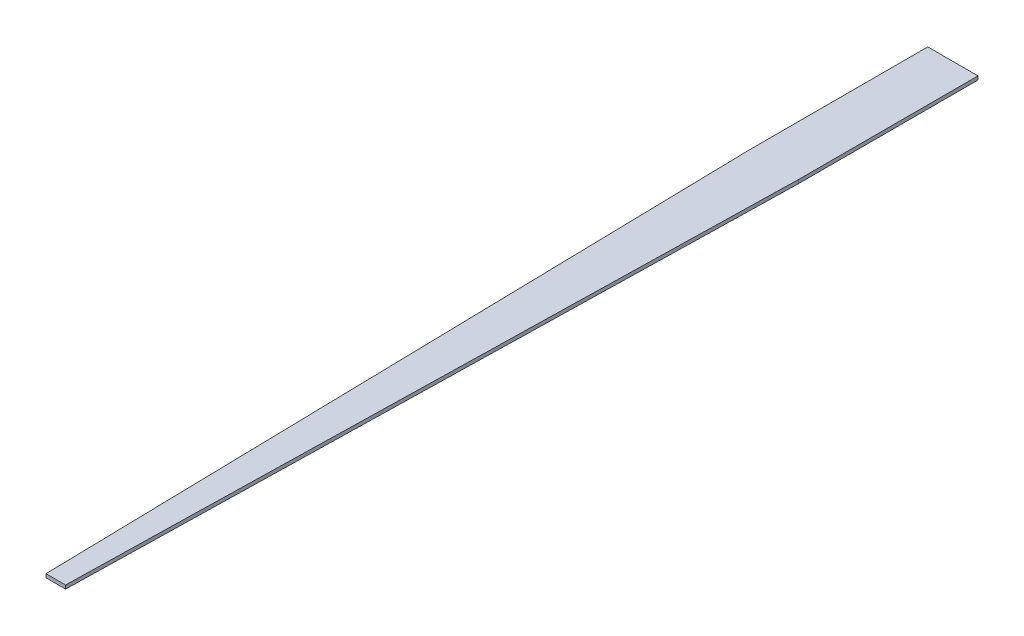
ISO-10303-21;
HEADER;
FILE_DESCRIPTION(('STEP AP214'),'2;1');
FILE_NAME('part.step','',(''),(''),'','','');
FILE_SCHEMA(('AUTOMOTIVE_DESIGN { 1 0 10303 214 1 1 1 1 }'));
ENDSEC;
DATA;
#1=APPLICATION_CONTEXT('core data for automotive mechanical design processes');
#2=APPLICATION_PROTOCOL_DEFINITION('international standard','automotive_design',2000,#1);
#3=PRODUCT_CONTEXT('',#1,'mechanical');
#4=PRODUCT('Part','Part','',(#3));
#5=PRODUCT_RELATED_PRODUCT_CATEGORY('part','',(#4));
#6=PRODUCT_DEFINITION_FORMATION('','',#4);
#7=PRODUCT_DEFINITION_CONTEXT('part definition',#1,'design');
#8=PRODUCT_DEFINITION('design','',#6,#7);
#9=PRODUCT_DEFINITION_SHAPE('','',#8);
#10=(LENGTH_UNIT() NAMED_UNIT(*) SI_UNIT(.MILLI.,.METRE.));
#11=(NAMED_UNIT(*) PLANE_ANGLE_UNIT() SI_UNIT($,.RADIAN.));
#12=(NAMED_UNIT(*) SI_UNIT($,.STERADIAN.) SOLID_ANGLE_UNIT());
#13=UNCERTAINTY_MEASURE_WITH_UNIT(LENGTH_MEASURE(1.E-05),#10,'distance_accuracy_value','');
#14=(GEOMETRIC_REPRESENTATION_CONTEXT(3) GLOBAL_UNCERTAINTY_ASSIGNED_CONTEXT((#13)) GLOBAL_UNIT_ASSIGNED_CONTEXT((#10,
#11,#12)) REPRESENTATION_CONTEXT('',''));
#15=CARTESIAN_POINT('',(0.,0.,0.));
#16=DIRECTION('',(0.,0.,1.));
#17=DIRECTION('',(1.,0.,0.));
#18=AXIS2_PLACEMENT_3D('',#15,#16,#17);
#19=CARTESIAN_POINT('',(4.27304768457274,1.,-0.0913363942577423));
#20=DIRECTION('',(-0.999771632938598,0.,0.0213701186540625));
#21=DIRECTION('',(0.0213701186540625,0.,0.999771632938598));
#22=AXIS2_PLACEMENT_3D('',#19,#20,#21);
#23=PLANE('',#22);
#24=DIRECTION('',(-0.0213701186540625,0.,-0.999771632938598));
#25=VECTOR('',#24,1.);
#26=CARTESIAN_POINT('',(4.27304768457274,0.,-0.0913363942577423));
#27=LINE('',#26,#25);
#28=CARTESIAN_POINT('',(4.275,0.,0.));
#29=VERTEX_POINT('',#28);
#30=CARTESIAN_POINT('',(0.,0.,-200.));
#31=VERTEX_POINT('',#30);
#32=EDGE_CURVE('E126',#29,#31,#27,.T.);
#33=ORIENTED_EDGE('',*,*,#32,.F.);
#34=DIRECTION('',(0.,-1.,0.));
#35=VECTOR('',#34,1.);
#36=CARTESIAN_POINT('',(4.275,1.,0.));
#37=LINE('',#36,#35);
#38=CARTESIAN_POINT('',(4.275,1.,0.));
#39=VERTEX_POINT('',#38);
#40=EDGE_CURVE('E11',#39,#29,#37,.T.);
#41=ORIENTED_EDGE('',*,*,#40,.F.);
#42=DIRECTION('',(-0.0213701186540625,0.,-0.999771632938598));
#43=VECTOR('',#42,1.);
#44=CARTESIAN_POINT('',(4.27304768457274,1.,-0.0913363942577423));
#45=LINE('',#44,#43);
#46=CARTESIAN_POINT('',(0.,1.,-200.));
#47=VERTEX_POINT('',#46);
#48=EDGE_CURVE('E57',#39,#47,#45,.T.);
#49=ORIENTED_EDGE('',*,*,#48,.T.);
#50=DIRECTION('',(0.,-1.,0.));
#51=VECTOR('',#50,1.);
#52=CARTESIAN_POINT('',(0.,1.,-200.));
#53=LINE('',#52,#51);
#54=EDGE_CURVE('E76',#47,#31,#53,.T.);
#55=ORIENTED_EDGE('',*,*,#54,.T.);
#56=EDGE_LOOP('',(#33,#41,#49,#55));
#57=FACE_BOUND('',#56,.T.);
#58=ADVANCED_FACE('F41',(#57),#23,.T.);
#59=CARTESIAN_POINT('',(0.,1.,0.));
#60=DIRECTION('',(0.,0.,-1.));
#61=DIRECTION('',(-1.,0.,0.));
#62=AXIS2_PLACEMENT_3D('',#59,#60,#61);
#63=PLANE('',#62);
#64=DIRECTION('',(1.,0.,0.));
#65=VECTOR('',#64,1.);
#66=CARTESIAN_POINT('',(0.,0.,0.));
#67=LINE('',#66,#65);
#68=CARTESIAN_POINT('',(9.725,0.,0.));
#69=VERTEX_POINT('',#68);
#70=EDGE_CURVE('E71',#29,#69,#67,.T.);
#71=ORIENTED_EDGE('',*,*,#70,.T.);
#72=DIRECTION('',(0.,-1.,0.));
#73=VECTOR('',#72,1.);
#74=CARTESIAN_POINT('',(9.725,1.,0.));
#75=LINE('',#74,#73);
#76=CARTESIAN_POINT('',(9.725,1.,0.));
#77=VERTEX_POINT('',#76);
#78=EDGE_CURVE('E49',#77,#69,#75,.T.);
#79=ORIENTED_EDGE('',*,*,#78,.F.);
#80=DIRECTION('',(1.,0.,0.));
#81=VECTOR('',#80,1.);
#82=CARTESIAN_POINT('',(0.,1.,0.));
#83=LINE('',#82,#81);
#84=EDGE_CURVE('E130',#39,#77,#83,.T.);
#85=ORIENTED_EDGE('',*,*,#84,.F.);
#86=ORIENTED_EDGE('',*,*,#40,.T.);
#87=EDGE_LOOP('',(#71,#79,#85,#86));
#88=FACE_BOUND('',#87,.T.);
#89=ADVANCED_FACE('F158',(#88),#63,.F.);
#90=CARTESIAN_POINT('',(9.72055876782921,1.,0.20777694366235));
#91=DIRECTION('',(-0.999771632938598,0.,-0.0213701186540626));
#92=DIRECTION('',(-0.0213701186540626,0.,0.999771632938598));
#93=AXIS2_PLACEMENT_3D('',#90,#91,#92);
#94=PLANE('',#93);
#95=DIRECTION('',(0.0213701186540626,0.,-0.999771632938598));
#96=VECTOR('',#95,1.);
#97=CARTESIAN_POINT('',(9.72055876782921,0.,0.20777694366235));
#98=LINE('',#97,#96);
#99=CARTESIAN_POINT('',(14.,0.,-200.));
#100=VERTEX_POINT('',#99);
#101=EDGE_CURVE('E131',#69,#100,#98,.T.);
#102=ORIENTED_EDGE('',*,*,#101,.T.);
#103=DIRECTION('',(0.,-1.,0.));
#104=VECTOR('',#103,1.);
#105=CARTESIAN_POINT('',(14.,1.,-200.));
#106=LINE('',#105,#104);
#107=CARTESIAN_POINT('',(14.,1.,-200.));
#108=VERTEX_POINT('',#107);
#109=EDGE_CURVE('E139',#108,#100,#106,.T.);
#110=ORIENTED_EDGE('',*,*,#109,.F.);
#111=DIRECTION('',(0.0213701186540626,0.,-0.999771632938598));
#112=VECTOR('',#111,1.);
#113=CARTESIAN_POINT('',(9.72055876782921,1.,0.20777694366235));
#114=LINE('',#113,#112);
#115=EDGE_CURVE('E133',#77,#108,#114,.T.);
#116=ORIENTED_EDGE('',*,*,#115,.F.);
#117=ORIENTED_EDGE('',*,*,#78,.T.);
#118=EDGE_LOOP('',(#102,#110,#116,#117));
#119=FACE_BOUND('',#118,.T.);
#120=ADVANCED_FACE('F144',(#119),#94,.F.);
#121=CARTESIAN_POINT('',(0.,1.,0.));
#122=DIRECTION('',(0.,1.,0.));
#123=DIRECTION('',(0.,0.,1.));
#124=AXIS2_PLACEMENT_3D('',#121,#122,#123);
#125=PLANE('',#124);
#126=ORIENTED_EDGE('',*,*,#48,.F.);
#127=ORIENTED_EDGE('',*,*,#84,.T.);
#128=ORIENTED_EDGE('',*,*,#115,.T.);
#129=DIRECTION('',(0.,0.,1.));
#130=VECTOR('',#129,1.);
#131=CARTESIAN_POINT('',(14.,1.,-250.));
#132=LINE('',#131,#130);
#133=CARTESIAN_POINT('',(14.,1.,-250.));
#134=VERTEX_POINT('',#133);
#135=EDGE_CURVE('E103',#134,#108,#132,.T.);
#136=ORIENTED_EDGE('',*,*,#135,.F.);
#137=DIRECTION('',(1.,0.,0.));
#138=VECTOR('',#137,1.);
#139=CARTESIAN_POINT('',(0.,1.,-250.));
#140=LINE('',#139,#138);
#141=CARTESIAN_POINT('',(0.,1.,-250.));
#142=VERTEX_POINT('',#141);
#143=EDGE_CURVE('E97',#142,#134,#140,.T.);
#144=ORIENTED_EDGE('',*,*,#143,.F.);
#145=DIRECTION('',(0.,0.,-1.));
#146=VECTOR('',#145,1.);
#147=CARTESIAN_POINT('',(0.,1.,-200.));
#148=LINE('',#147,#146);
#149=EDGE_CURVE('E101',#47,#142,#148,.T.);
#150=ORIENTED_EDGE('',*,*,#149,.F.);
#151=EDGE_LOOP('',(#126,#127,#128,#136,#144,#150));
#152=FACE_BOUND('',#151,.T.);
#153=ADVANCED_FACE('F99',(#152),#125,.T.);
#154=CARTESIAN_POINT('',(0.,0.,0.));
#155=DIRECTION('',(0.,1.,0.));
#156=DIRECTION('',(0.,0.,1.));
#157=AXIS2_PLACEMENT_3D('',#154,#155,#156);
#158=PLANE('',#157);
#159=ORIENTED_EDGE('',*,*,#32,.T.);
#160=DIRECTION('',(0.,0.,-1.));
#161=VECTOR('',#160,1.);
#162=CARTESIAN_POINT('',(0.,0.,-200.));
#163=LINE('',#162,#161);
#164=CARTESIAN_POINT('',(0.,0.,-250.));
#165=VERTEX_POINT('',#164);
#166=EDGE_CURVE('E124',#31,#165,#163,.T.);
#167=ORIENTED_EDGE('',*,*,#166,.T.);
#168=DIRECTION('',(1.,0.,0.));
#169=VECTOR('',#168,1.);
#170=CARTESIAN_POINT('',(0.,0.,-250.));
#171=LINE('',#170,#169);
#172=CARTESIAN_POINT('',(14.,0.,-250.));
#173=VERTEX_POINT('',#172);
#174=EDGE_CURVE('E112',#165,#173,#171,.T.);
#175=ORIENTED_EDGE('',*,*,#174,.T.);
#176=DIRECTION('',(0.,0.,1.));
#177=VECTOR('',#176,1.);
#178=CARTESIAN_POINT('',(14.,0.,-250.));
#179=LINE('',#178,#177);
#180=EDGE_CURVE('E118',#173,#100,#179,.T.);
#181=ORIENTED_EDGE('',*,*,#180,.T.);
#182=ORIENTED_EDGE('',*,*,#101,.F.);
#183=ORIENTED_EDGE('',*,*,#70,.F.);
#184=EDGE_LOOP('',(#159,#167,#175,#181,#182,#183));
#185=FACE_BOUND('',#184,.T.);
#186=ADVANCED_FACE('F147',(#185),#158,.F.);
#187=CARTESIAN_POINT('',(0.,52.9230199429887,-200.));
#188=DIRECTION('',(-1.,0.,0.));
#189=DIRECTION('',(0.,0.,1.));
#190=AXIS2_PLACEMENT_3D('',#187,#188,#189);
#191=PLANE('',#190);
#192=ORIENTED_EDGE('',*,*,#54,.F.);
#193=ORIENTED_EDGE('',*,*,#149,.T.);
#194=DIRECTION('',(0.,-1.,0.));
#195=VECTOR('',#194,1.);
#196=CARTESIAN_POINT('',(0.,52.9230199429887,-250.));
#197=LINE('',#196,#195);
#198=EDGE_CURVE('E107',#142,#165,#197,.T.);
#199=ORIENTED_EDGE('',*,*,#198,.T.);
#200=ORIENTED_EDGE('',*,*,#166,.F.);
#201=EDGE_LOOP('',(#192,#193,#199,#200));
#202=FACE_BOUND('',#201,.T.);
#203=ADVANCED_FACE('F117',(#202),#191,.T.);
#204=CARTESIAN_POINT('',(0.,52.9230199429887,-250.));
#205=DIRECTION('',(0.,0.,-1.));
#206=DIRECTION('',(-1.,0.,0.));
#207=AXIS2_PLACEMENT_3D('',#204,#205,#206);
#208=PLANE('',#207);
#209=ORIENTED_EDGE('',*,*,#198,.F.);
#210=ORIENTED_EDGE('',*,*,#143,.T.);
#211=DIRECTION('',(0.,-1.,0.));
#212=VECTOR('',#211,1.);
#213=CARTESIAN_POINT('',(14.,52.9230199429887,-250.));
#214=LINE('',#213,#212);
#215=EDGE_CURVE('E106',#134,#173,#214,.T.);
#216=ORIENTED_EDGE('',*,*,#215,.T.);
#217=ORIENTED_EDGE('',*,*,#174,.F.);
#218=EDGE_LOOP('',(#209,#210,#216,#217));
#219=FACE_BOUND('',#218,.T.);
#220=ADVANCED_FACE('F110',(#219),#208,.T.);
#221=CARTESIAN_POINT('',(14.,52.9230199429887,-250.));
#222=DIRECTION('',(1.,0.,0.));
#223=DIRECTION('',(0.,0.,-1.));
#224=AXIS2_PLACEMENT_3D('',#221,#222,#223);
#225=PLANE('',#224);
#226=ORIENTED_EDGE('',*,*,#215,.F.);
#227=ORIENTED_EDGE('',*,*,#135,.T.);
#228=ORIENTED_EDGE('',*,*,#109,.T.);
#229=ORIENTED_EDGE('',*,*,#180,.F.);
#230=EDGE_LOOP('',(#226,#227,#228,#229));
#231=FACE_BOUND('',#230,.T.);
#232=ADVANCED_FACE('F150',(#231),#225,.T.);
#233=CLOSED_SHELL('',(#58,#89,#120,#153,#186,#203,#220,#232));
#234=MANIFOLD_SOLID_BREP('B2',#233);
#235=ADVANCED_BREP_SHAPE_REPRESENTATION('',(#18,#234),#14);
#236=SHAPE_DEFINITION_REPRESENTATION(#9,#235);
ENDSEC;
END-ISO-10303-21;
